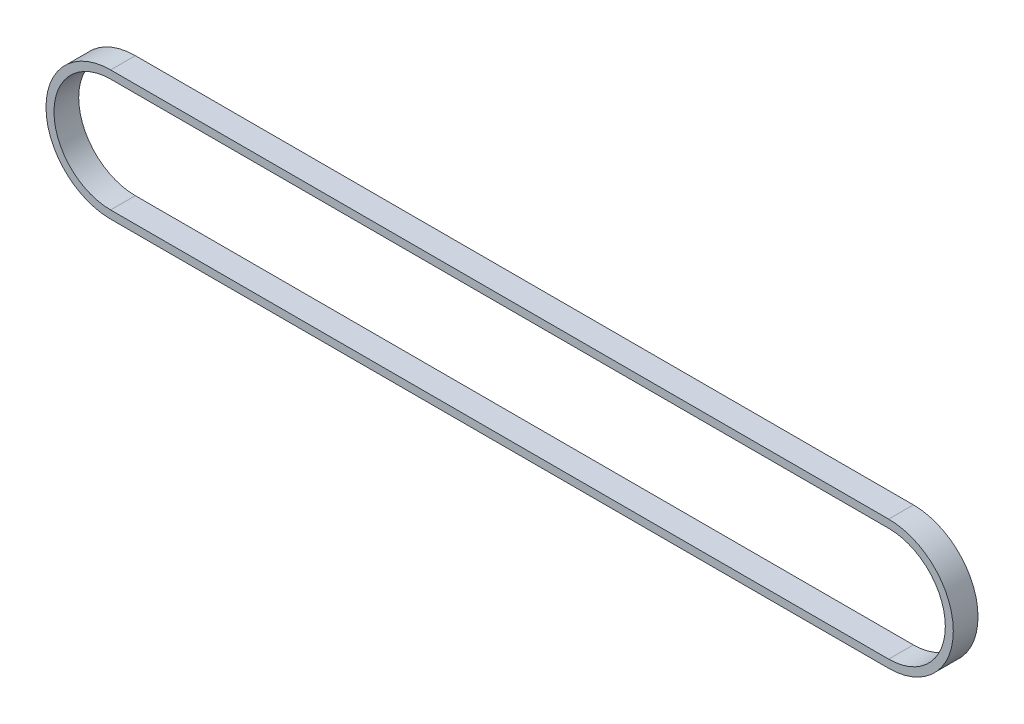
ISO-10303-21;
HEADER;
FILE_DESCRIPTION(('STEP AP214'),'2;1');
FILE_NAME('part.step','',(''),(''),'','','');
FILE_SCHEMA(('AUTOMOTIVE_DESIGN { 1 0 10303 214 1 1 1 1 }'));
ENDSEC;
DATA;
#1=APPLICATION_CONTEXT('core data for automotive mechanical design processes');
#2=APPLICATION_PROTOCOL_DEFINITION('international standard','automotive_design',2000,#1);
#3=PRODUCT_CONTEXT('',#1,'mechanical');
#4=PRODUCT('Part','Part','',(#3));
#5=PRODUCT_RELATED_PRODUCT_CATEGORY('part','',(#4));
#6=PRODUCT_DEFINITION_FORMATION('','',#4);
#7=PRODUCT_DEFINITION_CONTEXT('part definition',#1,'design');
#8=PRODUCT_DEFINITION('design','',#6,#7);
#9=PRODUCT_DEFINITION_SHAPE('','',#8);
#10=(LENGTH_UNIT() NAMED_UNIT(*) SI_UNIT(.MILLI.,.METRE.));
#11=(NAMED_UNIT(*) PLANE_ANGLE_UNIT() SI_UNIT($,.RADIAN.));
#12=(NAMED_UNIT(*) SI_UNIT($,.STERADIAN.) SOLID_ANGLE_UNIT());
#13=UNCERTAINTY_MEASURE_WITH_UNIT(LENGTH_MEASURE(1.E-05),#10,'distance_accuracy_value','');
#14=(GEOMETRIC_REPRESENTATION_CONTEXT(3) GLOBAL_UNCERTAINTY_ASSIGNED_CONTEXT((#13)) GLOBAL_UNIT_ASSIGNED_CONTEXT((#10,
#11,#12)) REPRESENTATION_CONTEXT('',''));
#15=CARTESIAN_POINT('',(0.,0.,0.));
#16=DIRECTION('',(0.,0.,1.));
#17=DIRECTION('',(1.,0.,0.));
#18=AXIS2_PLACEMENT_3D('',#15,#16,#17);
#19=CARTESIAN_POINT('',(-89.,7.49999999999999,3.));
#20=DIRECTION('',(0.,0.,1.));
#21=DIRECTION('',(1.,0.,0.));
#22=AXIS2_PLACEMENT_3D('',#19,#20,#21);
#23=PLANE('',#22);
#24=CARTESIAN_POINT('',(-89.,7.49999999999999,3.));
#25=DIRECTION('',(0.,0.,1.));
#26=DIRECTION('',(1.,0.,0.));
#27=AXIS2_PLACEMENT_3D('',#24,#25,#26);
#28=CIRCLE('',#27,15.699);
#29=CARTESIAN_POINT('',(-89.,23.199,3.));
#30=VERTEX_POINT('',#29);
#31=CARTESIAN_POINT('',(-89.,-8.19900000000002,3.));
#32=VERTEX_POINT('',#31);
#33=EDGE_CURVE('E157',#30,#32,#28,.T.);
#34=ORIENTED_EDGE('',*,*,#33,.T.);
#35=DIRECTION('',(1.,0.,0.));
#36=VECTOR('',#35,1.);
#37=CARTESIAN_POINT('',(-89.,-8.19900000000002,3.));
#38=LINE('',#37,#36);
#39=CARTESIAN_POINT('',(100.,-8.19900000000002,3.));
#40=VERTEX_POINT('',#39);
#41=EDGE_CURVE('E161',#32,#40,#38,.T.);
#42=ORIENTED_EDGE('',*,*,#41,.T.);
#43=CARTESIAN_POINT('',(100.,7.49999999999998,3.));
#44=DIRECTION('',(0.,0.,1.));
#45=DIRECTION('',(1.,0.,0.));
#46=AXIS2_PLACEMENT_3D('',#43,#44,#45);
#47=CIRCLE('',#46,15.699);
#48=CARTESIAN_POINT('',(100.,23.199,3.));
#49=VERTEX_POINT('',#48);
#50=EDGE_CURVE('E165',#40,#49,#47,.T.);
#51=ORIENTED_EDGE('',*,*,#50,.T.);
#52=DIRECTION('',(-1.,0.,0.));
#53=VECTOR('',#52,1.);
#54=CARTESIAN_POINT('',(-89.,23.199,3.));
#55=LINE('',#54,#53);
#56=EDGE_CURVE('E168',#49,#30,#55,.T.);
#57=ORIENTED_EDGE('',*,*,#56,.T.);
#58=EDGE_LOOP('',(#34,#42,#51,#57));
#59=FACE_BOUND('',#58,.T.);
#60=DIRECTION('',(1.,0.,0.));
#61=VECTOR('',#60,1.);
#62=CARTESIAN_POINT('',(-89.,-6.25900000000002,3.));
#63=LINE('',#62,#61);
#64=CARTESIAN_POINT('',(-89.,-6.25900000000002,3.));
#65=VERTEX_POINT('',#64);
#66=CARTESIAN_POINT('',(100.,-6.25900000000002,3.));
#67=VERTEX_POINT('',#66);
#68=EDGE_CURVE('E117',#65,#67,#63,.T.);
#69=ORIENTED_EDGE('',*,*,#68,.F.);
#70=CARTESIAN_POINT('',(-89.,7.49999999999999,3.));
#71=DIRECTION('',(0.,0.,1.));
#72=DIRECTION('',(1.,0.,0.));
#73=AXIS2_PLACEMENT_3D('',#70,#71,#72);
#74=CIRCLE('',#73,13.759);
#75=CARTESIAN_POINT('',(-89.,21.259,3.));
#76=VERTEX_POINT('',#75);
#77=EDGE_CURVE('E108',#76,#65,#74,.T.);
#78=ORIENTED_EDGE('',*,*,#77,.F.);
#79=DIRECTION('',(-1.,0.,0.));
#80=VECTOR('',#79,1.);
#81=CARTESIAN_POINT('',(-89.,21.259,3.));
#82=LINE('',#81,#80);
#83=CARTESIAN_POINT('',(100.,21.259,3.));
#84=VERTEX_POINT('',#83);
#85=EDGE_CURVE('E135',#84,#76,#82,.T.);
#86=ORIENTED_EDGE('',*,*,#85,.F.);
#87=CARTESIAN_POINT('',(100.,7.49999999999998,3.));
#88=DIRECTION('',(0.,0.,1.));
#89=DIRECTION('',(1.,0.,0.));
#90=AXIS2_PLACEMENT_3D('',#87,#88,#89);
#91=CIRCLE('',#90,13.759);
#92=EDGE_CURVE('E130',#67,#84,#91,.T.);
#93=ORIENTED_EDGE('',*,*,#92,.F.);
#94=EDGE_LOOP('',(#69,#78,#86,#93));
#95=FACE_BOUND('',#94,.T.);
#96=ADVANCED_FACE('F42',(#59,#95),#23,.T.);
#97=CARTESIAN_POINT('',(-89.,7.49999999999999,-3.));
#98=DIRECTION('',(0.,0.,1.));
#99=DIRECTION('',(1.,0.,0.));
#100=AXIS2_PLACEMENT_3D('',#97,#98,#99);
#101=PLANE('',#100);
#102=CARTESIAN_POINT('',(-89.,7.49999999999999,-3.));
#103=DIRECTION('',(0.,0.,1.));
#104=DIRECTION('',(1.,0.,0.));
#105=AXIS2_PLACEMENT_3D('',#102,#103,#104);
#106=CIRCLE('',#105,15.699);
#107=CARTESIAN_POINT('',(-89.,23.199,-3.));
#108=VERTEX_POINT('',#107);
#109=CARTESIAN_POINT('',(-89.,-8.19900000000002,-3.));
#110=VERTEX_POINT('',#109);
#111=EDGE_CURVE('E126',#108,#110,#106,.T.);
#112=ORIENTED_EDGE('',*,*,#111,.F.);
#113=DIRECTION('',(-1.,0.,0.));
#114=VECTOR('',#113,1.);
#115=CARTESIAN_POINT('',(-89.,23.199,-3.));
#116=LINE('',#115,#114);
#117=CARTESIAN_POINT('',(100.,23.199,-3.));
#118=VERTEX_POINT('',#117);
#119=EDGE_CURVE('E162',#118,#108,#116,.T.);
#120=ORIENTED_EDGE('',*,*,#119,.F.);
#121=CARTESIAN_POINT('',(100.,7.49999999999998,-3.));
#122=DIRECTION('',(0.,0.,1.));
#123=DIRECTION('',(1.,0.,0.));
#124=AXIS2_PLACEMENT_3D('',#121,#122,#123);
#125=CIRCLE('',#124,15.699);
#126=CARTESIAN_POINT('',(100.,-8.19900000000002,-3.));
#127=VERTEX_POINT('',#126);
#128=EDGE_CURVE('E178',#127,#118,#125,.T.);
#129=ORIENTED_EDGE('',*,*,#128,.F.);
#130=DIRECTION('',(1.,0.,0.));
#131=VECTOR('',#130,1.);
#132=CARTESIAN_POINT('',(-89.,-8.19900000000002,-3.));
#133=LINE('',#132,#131);
#134=EDGE_CURVE('E175',#110,#127,#133,.T.);
#135=ORIENTED_EDGE('',*,*,#134,.F.);
#136=EDGE_LOOP('',(#112,#120,#129,#135));
#137=FACE_BOUND('',#136,.T.);
#138=CARTESIAN_POINT('',(-89.,7.49999999999999,-3.));
#139=DIRECTION('',(0.,0.,1.));
#140=DIRECTION('',(1.,0.,0.));
#141=AXIS2_PLACEMENT_3D('',#138,#139,#140);
#142=CIRCLE('',#141,13.759);
#143=CARTESIAN_POINT('',(-89.,21.259,-3.));
#144=VERTEX_POINT('',#143);
#145=CARTESIAN_POINT('',(-89.,-6.25900000000002,-3.));
#146=VERTEX_POINT('',#145);
#147=EDGE_CURVE('E66',#144,#146,#142,.T.);
#148=ORIENTED_EDGE('',*,*,#147,.T.);
#149=DIRECTION('',(1.,0.,0.));
#150=VECTOR('',#149,1.);
#151=CARTESIAN_POINT('',(-89.,-6.25900000000002,-3.));
#152=LINE('',#151,#150);
#153=CARTESIAN_POINT('',(100.,-6.25900000000002,-3.));
#154=VERTEX_POINT('',#153);
#155=EDGE_CURVE('E124',#146,#154,#152,.T.);
#156=ORIENTED_EDGE('',*,*,#155,.T.);
#157=CARTESIAN_POINT('',(100.,7.49999999999998,-3.));
#158=DIRECTION('',(0.,0.,1.));
#159=DIRECTION('',(1.,0.,0.));
#160=AXIS2_PLACEMENT_3D('',#157,#158,#159);
#161=CIRCLE('',#160,13.759);
#162=CARTESIAN_POINT('',(100.,21.259,-3.));
#163=VERTEX_POINT('',#162);
#164=EDGE_CURVE('E144',#154,#163,#161,.T.);
#165=ORIENTED_EDGE('',*,*,#164,.T.);
#166=DIRECTION('',(-1.,0.,0.));
#167=VECTOR('',#166,1.);
#168=CARTESIAN_POINT('',(-89.,21.259,-3.));
#169=LINE('',#168,#167);
#170=EDGE_CURVE('E118',#163,#144,#169,.T.);
#171=ORIENTED_EDGE('',*,*,#170,.T.);
#172=EDGE_LOOP('',(#148,#156,#165,#171));
#173=FACE_BOUND('',#172,.T.);
#174=ADVANCED_FACE('F202',(#137,#173),#101,.F.);
#175=CARTESIAN_POINT('',(-89.,7.49999999999999,3.));
#176=DIRECTION('',(0.,0.,-1.));
#177=DIRECTION('',(-1.,0.,0.));
#178=AXIS2_PLACEMENT_3D('',#175,#176,#177);
#179=CYLINDRICAL_SURFACE('',#178,15.699);
#180=ORIENTED_EDGE('',*,*,#111,.T.);
#181=DIRECTION('',(0.,0.,-1.));
#182=VECTOR('',#181,1.);
#183=CARTESIAN_POINT('',(-89.,-8.19900000000002,3.));
#184=LINE('',#183,#182);
#185=EDGE_CURVE('E11',#32,#110,#184,.T.);
#186=ORIENTED_EDGE('',*,*,#185,.F.);
#187=ORIENTED_EDGE('',*,*,#33,.F.);
#188=DIRECTION('',(0.,0.,-1.));
#189=VECTOR('',#188,1.);
#190=CARTESIAN_POINT('',(-89.,23.199,3.));
#191=LINE('',#190,#189);
#192=EDGE_CURVE('E171',#30,#108,#191,.T.);
#193=ORIENTED_EDGE('',*,*,#192,.T.);
#194=EDGE_LOOP('',(#180,#186,#187,#193));
#195=FACE_BOUND('',#194,.T.);
#196=ADVANCED_FACE('F44',(#195),#179,.T.);
#197=CARTESIAN_POINT('',(-89.,-8.19900000000002,3.));
#198=DIRECTION('',(0.,1.,0.));
#199=DIRECTION('',(0.,0.,1.));
#200=AXIS2_PLACEMENT_3D('',#197,#198,#199);
#201=PLANE('',#200);
#202=ORIENTED_EDGE('',*,*,#134,.T.);
#203=DIRECTION('',(0.,0.,-1.));
#204=VECTOR('',#203,1.);
#205=CARTESIAN_POINT('',(100.,-8.19900000000002,3.));
#206=LINE('',#205,#204);
#207=EDGE_CURVE('E51',#40,#127,#206,.T.);
#208=ORIENTED_EDGE('',*,*,#207,.F.);
#209=ORIENTED_EDGE('',*,*,#41,.F.);
#210=ORIENTED_EDGE('',*,*,#185,.T.);
#211=EDGE_LOOP('',(#202,#208,#209,#210));
#212=FACE_BOUND('',#211,.T.);
#213=ADVANCED_FACE('F212',(#212),#201,.F.);
#214=CARTESIAN_POINT('',(100.,7.49999999999998,3.));
#215=DIRECTION('',(0.,0.,-1.));
#216=DIRECTION('',(-1.,0.,0.));
#217=AXIS2_PLACEMENT_3D('',#214,#215,#216);
#218=CYLINDRICAL_SURFACE('',#217,15.699);
#219=ORIENTED_EDGE('',*,*,#128,.T.);
#220=DIRECTION('',(0.,0.,-1.));
#221=VECTOR('',#220,1.);
#222=CARTESIAN_POINT('',(100.,23.199,3.));
#223=LINE('',#222,#221);
#224=EDGE_CURVE('E186',#49,#118,#223,.T.);
#225=ORIENTED_EDGE('',*,*,#224,.F.);
#226=ORIENTED_EDGE('',*,*,#50,.F.);
#227=ORIENTED_EDGE('',*,*,#207,.T.);
#228=EDGE_LOOP('',(#219,#225,#226,#227));
#229=FACE_BOUND('',#228,.T.);
#230=ADVANCED_FACE('F196',(#229),#218,.T.);
#231=CARTESIAN_POINT('',(-89.,23.199,3.));
#232=DIRECTION('',(0.,-1.,0.));
#233=DIRECTION('',(0.,0.,-1.));
#234=AXIS2_PLACEMENT_3D('',#231,#232,#233);
#235=PLANE('',#234);
#236=ORIENTED_EDGE('',*,*,#119,.T.);
#237=ORIENTED_EDGE('',*,*,#192,.F.);
#238=ORIENTED_EDGE('',*,*,#56,.F.);
#239=ORIENTED_EDGE('',*,*,#224,.T.);
#240=EDGE_LOOP('',(#236,#237,#238,#239));
#241=FACE_BOUND('',#240,.T.);
#242=ADVANCED_FACE('F206',(#241),#235,.F.);
#243=CARTESIAN_POINT('',(-89.,7.49999999999999,3.));
#244=DIRECTION('',(0.,0.,-1.));
#245=DIRECTION('',(-1.,0.,0.));
#246=AXIS2_PLACEMENT_3D('',#243,#244,#245);
#247=CYLINDRICAL_SURFACE('',#246,13.759);
#248=ORIENTED_EDGE('',*,*,#147,.F.);
#249=DIRECTION('',(0.,0.,-1.));
#250=VECTOR('',#249,1.);
#251=CARTESIAN_POINT('',(-89.,21.259,3.));
#252=LINE('',#251,#250);
#253=EDGE_CURVE('E112',#76,#144,#252,.T.);
#254=ORIENTED_EDGE('',*,*,#253,.F.);
#255=ORIENTED_EDGE('',*,*,#77,.T.);
#256=DIRECTION('',(0.,0.,-1.));
#257=VECTOR('',#256,1.);
#258=CARTESIAN_POINT('',(-89.,-6.25900000000002,3.));
#259=LINE('',#258,#257);
#260=EDGE_CURVE('E111',#65,#146,#259,.T.);
#261=ORIENTED_EDGE('',*,*,#260,.T.);
#262=EDGE_LOOP('',(#248,#254,#255,#261));
#263=FACE_BOUND('',#262,.T.);
#264=ADVANCED_FACE('F110',(#263),#247,.F.);
#265=CARTESIAN_POINT('',(-89.,-6.25900000000002,3.));
#266=DIRECTION('',(0.,1.,0.));
#267=DIRECTION('',(0.,0.,1.));
#268=AXIS2_PLACEMENT_3D('',#265,#266,#267);
#269=PLANE('',#268);
#270=ORIENTED_EDGE('',*,*,#155,.F.);
#271=ORIENTED_EDGE('',*,*,#260,.F.);
#272=ORIENTED_EDGE('',*,*,#68,.T.);
#273=DIRECTION('',(0.,0.,-1.));
#274=VECTOR('',#273,1.);
#275=CARTESIAN_POINT('',(100.,-6.25900000000002,3.));
#276=LINE('',#275,#274);
#277=EDGE_CURVE('E127',#67,#154,#276,.T.);
#278=ORIENTED_EDGE('',*,*,#277,.T.);
#279=EDGE_LOOP('',(#270,#271,#272,#278));
#280=FACE_BOUND('',#279,.T.);
#281=ADVANCED_FACE('F121',(#280),#269,.T.);
#282=CARTESIAN_POINT('',(100.,7.49999999999998,3.));
#283=DIRECTION('',(0.,0.,-1.));
#284=DIRECTION('',(-1.,0.,0.));
#285=AXIS2_PLACEMENT_3D('',#282,#283,#284);
#286=CYLINDRICAL_SURFACE('',#285,13.759);
#287=ORIENTED_EDGE('',*,*,#164,.F.);
#288=ORIENTED_EDGE('',*,*,#277,.F.);
#289=ORIENTED_EDGE('',*,*,#92,.T.);
#290=DIRECTION('',(0.,0.,-1.));
#291=VECTOR('',#290,1.);
#292=CARTESIAN_POINT('',(100.,21.259,3.));
#293=LINE('',#292,#291);
#294=EDGE_CURVE('E58',#84,#163,#293,.T.);
#295=ORIENTED_EDGE('',*,*,#294,.T.);
#296=EDGE_LOOP('',(#287,#288,#289,#295));
#297=FACE_BOUND('',#296,.T.);
#298=ADVANCED_FACE('F235',(#297),#286,.F.);
#299=CARTESIAN_POINT('',(-89.,21.259,3.));
#300=DIRECTION('',(0.,-1.,0.));
#301=DIRECTION('',(0.,0.,-1.));
#302=AXIS2_PLACEMENT_3D('',#299,#300,#301);
#303=PLANE('',#302);
#304=ORIENTED_EDGE('',*,*,#170,.F.);
#305=ORIENTED_EDGE('',*,*,#294,.F.);
#306=ORIENTED_EDGE('',*,*,#85,.T.);
#307=ORIENTED_EDGE('',*,*,#253,.T.);
#308=EDGE_LOOP('',(#304,#305,#306,#307));
#309=FACE_BOUND('',#308,.T.);
#310=ADVANCED_FACE('F239',(#309),#303,.T.);
#311=CLOSED_SHELL('',(#96,#174,#196,#213,#230,#242,#264,#281,#298,#310));
#312=MANIFOLD_SOLID_BREP('B2',#311);
#313=ADVANCED_BREP_SHAPE_REPRESENTATION('',(#18,#312),#14);
#314=SHAPE_DEFINITION_REPRESENTATION(#9,#313);
ENDSEC;
END-ISO-10303-21;
